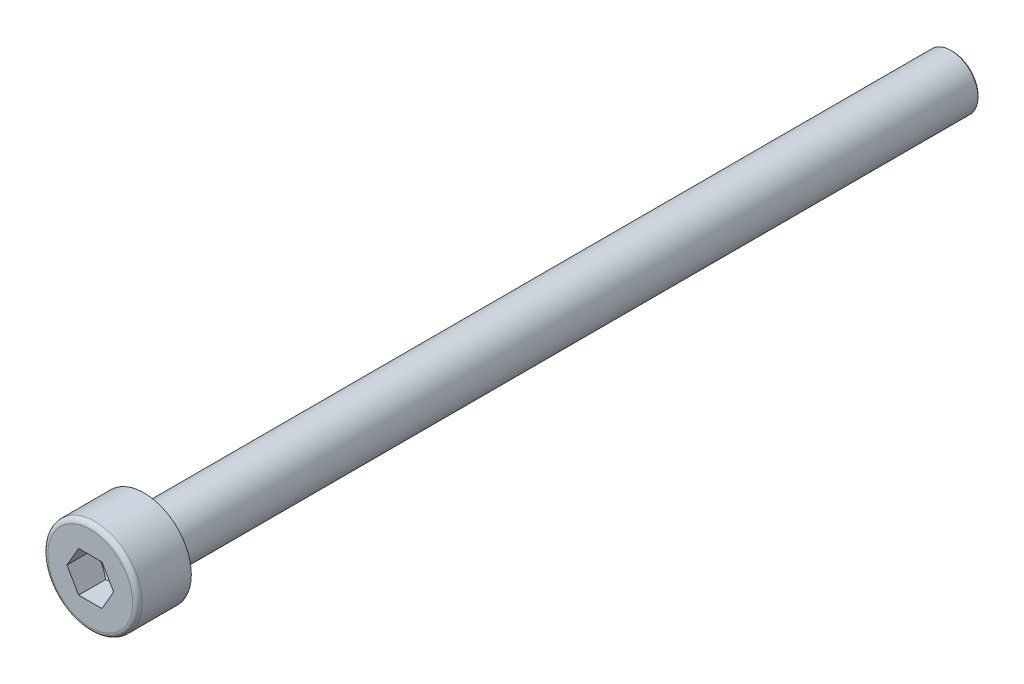
ISO-10303-21;
HEADER;
FILE_DESCRIPTION(('STEP AP214'),'2;1');
FILE_NAME('part.step','',(''),(''),'','','');
FILE_SCHEMA(('AUTOMOTIVE_DESIGN { 1 0 10303 214 1 1 1 1 }'));
ENDSEC;
DATA;
#1=APPLICATION_CONTEXT('core data for automotive mechanical design processes');
#2=APPLICATION_PROTOCOL_DEFINITION('international standard','automotive_design',2000,#1);
#3=PRODUCT_CONTEXT('',#1,'mechanical');
#4=PRODUCT('Part','Part','',(#3));
#5=PRODUCT_RELATED_PRODUCT_CATEGORY('part','',(#4));
#6=PRODUCT_DEFINITION_FORMATION('','',#4);
#7=PRODUCT_DEFINITION_CONTEXT('part definition',#1,'design');
#8=PRODUCT_DEFINITION('design','',#6,#7);
#9=PRODUCT_DEFINITION_SHAPE('','',#8);
#10=(LENGTH_UNIT() NAMED_UNIT(*) SI_UNIT(.MILLI.,.METRE.));
#11=(NAMED_UNIT(*) PLANE_ANGLE_UNIT() SI_UNIT($,.RADIAN.));
#12=(NAMED_UNIT(*) SI_UNIT($,.STERADIAN.) SOLID_ANGLE_UNIT());
#13=UNCERTAINTY_MEASURE_WITH_UNIT(LENGTH_MEASURE(1.E-05),#10,'distance_accuracy_value','');
#14=(GEOMETRIC_REPRESENTATION_CONTEXT(3) GLOBAL_UNCERTAINTY_ASSIGNED_CONTEXT((#13)) GLOBAL_UNIT_ASSIGNED_CONTEXT((#10,
#11,#12)) REPRESENTATION_CONTEXT('',''));
#15=CARTESIAN_POINT('',(0.,0.,0.));
#16=DIRECTION('',(0.,0.,1.));
#17=DIRECTION('',(1.,0.,0.));
#18=AXIS2_PLACEMENT_3D('',#15,#16,#17);
#19=CARTESIAN_POINT('',(0.,3.15,4.));
#20=DIRECTION('',(0.,0.,-1.));
#21=DIRECTION('',(-1.,0.,0.));
#22=AXIS2_PLACEMENT_3D('',#19,#20,#21);
#23=PLANE('',#22);
#24=CARTESIAN_POINT('',(0.,0.,4.));
#25=DIRECTION('',(0.,0.,1.));
#26=DIRECTION('',(1.,0.,0.));
#27=AXIS2_PLACEMENT_3D('',#24,#25,#26);
#28=CIRCLE('',#27,3.15);
#29=CARTESIAN_POINT('',(3.15,0.,4.));
#30=VERTEX_POINT('',#29);
#31=EDGE_CURVE('E136',#30,#30,#28,.T.);
#32=ORIENTED_EDGE('',*,*,#31,.T.);
#33=EDGE_LOOP('',(#32));
#34=FACE_BOUND('',#33,.T.);
#35=DIRECTION('',(0.5,-0.866025403784438,0.));
#36=VECTOR('',#35,1.);
#37=CARTESIAN_POINT('',(0.866025,1.49999930062484,4.));
#38=LINE('',#37,#36);
#39=CARTESIAN_POINT('',(0.866025,1.49999930062484,4.));
#40=VERTEX_POINT('',#39);
#41=CARTESIAN_POINT('',(1.73205,0.,4.));
#42=VERTEX_POINT('',#41);
#43=EDGE_CURVE('E50',#40,#42,#38,.T.);
#44=ORIENTED_EDGE('',*,*,#43,.T.);
#45=DIRECTION('',(-0.5,-0.866025403784439,0.));
#46=VECTOR('',#45,1.);
#47=CARTESIAN_POINT('',(1.73205,0.,4.));
#48=LINE('',#47,#46);
#49=CARTESIAN_POINT('',(0.866025,-1.49999930062484,4.));
#50=VERTEX_POINT('',#49);
#51=EDGE_CURVE('E199',#42,#50,#48,.T.);
#52=ORIENTED_EDGE('',*,*,#51,.T.);
#53=DIRECTION('',(-1.,0.,0.));
#54=VECTOR('',#53,1.);
#55=CARTESIAN_POINT('',(0.866025,-1.49999930062484,4.));
#56=LINE('',#55,#54);
#57=CARTESIAN_POINT('',(-0.866025,-1.49999930062484,4.));
#58=VERTEX_POINT('',#57);
#59=EDGE_CURVE('E253',#50,#58,#56,.T.);
#60=ORIENTED_EDGE('',*,*,#59,.T.);
#61=DIRECTION('',(-0.5,0.866025403784439,0.));
#62=VECTOR('',#61,1.);
#63=CARTESIAN_POINT('',(-0.866025,-1.49999930062484,4.));
#64=LINE('',#63,#62);
#65=CARTESIAN_POINT('',(-1.73205,0.,4.));
#66=VERTEX_POINT('',#65);
#67=EDGE_CURVE('E248',#58,#66,#64,.T.);
#68=ORIENTED_EDGE('',*,*,#67,.T.);
#69=DIRECTION('',(0.5,0.866025403784439,0.));
#70=VECTOR('',#69,1.);
#71=CARTESIAN_POINT('',(-1.73205,0.,4.));
#72=LINE('',#71,#70);
#73=CARTESIAN_POINT('',(-0.866025,1.49999930062484,4.));
#74=VERTEX_POINT('',#73);
#75=EDGE_CURVE('E122',#66,#74,#72,.T.);
#76=ORIENTED_EDGE('',*,*,#75,.T.);
#77=DIRECTION('',(1.,0.,0.));
#78=VECTOR('',#77,1.);
#79=CARTESIAN_POINT('',(-0.866025,1.49999930062484,4.));
#80=LINE('',#79,#78);
#81=EDGE_CURVE('E114',#74,#40,#80,.T.);
#82=ORIENTED_EDGE('',*,*,#81,.T.);
#83=EDGE_LOOP('',(#44,#52,#60,#68,#76,#82));
#84=FACE_BOUND('',#83,.T.);
#85=ADVANCED_FACE('F35',(#34,#84),#23,.F.);
#86=CARTESIAN_POINT('',(0.,0.,0.));
#87=DIRECTION('',(0.,0.,1.));
#88=DIRECTION('',(1.,0.,0.));
#89=AXIS2_PLACEMENT_3D('',#86,#87,#88);
#90=PLANE('',#89);
#91=CARTESIAN_POINT('',(0.,0.,0.));
#92=DIRECTION('',(0.,0.,1.));
#93=DIRECTION('',(1.,0.,0.));
#94=AXIS2_PLACEMENT_3D('',#91,#92,#93);
#95=CIRCLE('',#94,3.5);
#96=CARTESIAN_POINT('',(3.5,0.,0.));
#97=VERTEX_POINT('',#96);
#98=EDGE_CURVE('E144',#97,#97,#95,.T.);
#99=ORIENTED_EDGE('',*,*,#98,.F.);
#100=EDGE_LOOP('',(#99));
#101=FACE_BOUND('',#100,.T.);
#102=CARTESIAN_POINT('',(0.,0.,0.));
#103=DIRECTION('',(0.,0.,1.));
#104=DIRECTION('',(1.,0.,0.));
#105=AXIS2_PLACEMENT_3D('',#102,#103,#104);
#106=CIRCLE('',#105,2.);
#107=CARTESIAN_POINT('',(2.,0.,0.));
#108=VERTEX_POINT('',#107);
#109=EDGE_CURVE('E148',#108,#108,#106,.F.);
#110=ORIENTED_EDGE('',*,*,#109,.F.);
#111=EDGE_LOOP('',(#110));
#112=FACE_BOUND('',#111,.T.);
#113=ADVANCED_FACE('F164',(#101,#112),#90,.F.);
#114=CARTESIAN_POINT('',(0.,0.,4.));
#115=DIRECTION('',(0.,0.,1.));
#116=DIRECTION('',(1.,0.,0.));
#117=AXIS2_PLACEMENT_3D('',#114,#115,#116);
#118=CYLINDRICAL_SURFACE('',#117,3.5);
#119=CARTESIAN_POINT('',(0.,0.,3.65));
#120=DIRECTION('',(0.,0.,1.));
#121=DIRECTION('',(1.,0.,0.));
#122=AXIS2_PLACEMENT_3D('',#119,#120,#121);
#123=CIRCLE('',#122,3.5);
#124=CARTESIAN_POINT('',(3.5,0.,3.65));
#125=VERTEX_POINT('',#124);
#126=EDGE_CURVE('E140',#125,#125,#123,.T.);
#127=ORIENTED_EDGE('',*,*,#126,.F.);
#128=EDGE_LOOP('',(#127));
#129=FACE_BOUND('',#128,.T.);
#130=ORIENTED_EDGE('',*,*,#98,.T.);
#131=EDGE_LOOP('',(#130));
#132=FACE_BOUND('',#131,.T.);
#133=ADVANCED_FACE('F169',(#129,#132),#118,.T.);
#134=CARTESIAN_POINT('',(0.,0.,3.65));
#135=DIRECTION('',(0.,0.,1.));
#136=DIRECTION('',(1.,0.,0.));
#137=AXIS2_PLACEMENT_3D('',#134,#135,#136);
#138=TOROIDAL_SURFACE('',#137,3.15,0.35);
#139=ORIENTED_EDGE('',*,*,#31,.F.);
#140=EDGE_LOOP('',(#139));
#141=FACE_BOUND('',#140,.T.);
#142=ORIENTED_EDGE('',*,*,#126,.T.);
#143=EDGE_LOOP('',(#142));
#144=FACE_BOUND('',#143,.T.);
#145=ADVANCED_FACE('F176',(#141,#144),#138,.T.);
#146=CARTESIAN_POINT('',(0.866025,1.49999930062484,1.00000046625011));
#147=DIRECTION('',(-0.866025403784438,-0.5,0.));
#148=DIRECTION('',(-0.5,0.866025403784438,0.));
#149=AXIS2_PLACEMENT_3D('',#146,#147,#148);
#150=PLANE('',#149);
#151=DIRECTION('',(0.,0.,1.));
#152=VECTOR('',#151,1.);
#153=CARTESIAN_POINT('',(1.73205,0.,1.00000046625011));
#154=LINE('',#153,#152);
#155=CARTESIAN_POINT('',(1.73205,0.,2.));
#156=VERTEX_POINT('',#155);
#157=EDGE_CURVE('E134',#156,#42,#154,.T.);
#158=ORIENTED_EDGE('',*,*,#157,.T.);
#159=ORIENTED_EDGE('',*,*,#43,.F.);
#160=DIRECTION('',(0.,0.,1.));
#161=VECTOR('',#160,1.);
#162=CARTESIAN_POINT('',(0.866025,1.49999930062484,1.00000046625011));
#163=LINE('',#162,#161);
#164=CARTESIAN_POINT('',(0.866025,1.49999930062484,2.));
#165=VERTEX_POINT('',#164);
#166=EDGE_CURVE('E107',#165,#40,#163,.T.);
#167=ORIENTED_EDGE('',*,*,#166,.F.);
#168=CARTESIAN_POINT('',(1.73205115470054,-2.E-06,2.00000066666734));
#169=CARTESIAN_POINT('',(1.69399458130122,0.0659139186895892,1.97802228100261));
#170=CARTESIAN_POINT('',(1.65560950414464,0.132398822577242,1.95803408114054));
#171=CARTESIAN_POINT('',(1.57817473630843,0.266519774741864,1.92314525941874));
#172=CARTESIAN_POINT('',(1.53912367019894,0.334158205333232,1.90825697858766));
#173=CARTESIAN_POINT('',(1.46150547885139,0.468596856338784,1.88508226983918));
#174=CARTESIAN_POINT('',(1.42295029290091,0.535376397300293,1.87664158385231));
#175=CARTESIAN_POINT('',(1.34565859846878,0.669249539059823,1.86656700525616));
#176=CARTESIAN_POINT('',(1.30692237073331,0.736342653591208,1.86492476807133));
#177=CARTESIAN_POINT('',(1.23454773253413,0.861699204131607,1.86834969801067));
#178=CARTESIAN_POINT('',(1.20089846229767,0.919981449818777,1.87257593125167));
#179=CARTESIAN_POINT('',(1.1338191361032,1.03616625092508,1.88596796669928));
#180=CARTESIAN_POINT('',(1.10038931198579,1.09406840478452,1.89513833923059));
#181=CARTESIAN_POINT('',(1.03317179328088,1.21049256234014,1.91806252128818));
#182=CARTESIAN_POINT('',(0.999392601793287,1.26899983823525,1.93191346069662));
#183=CARTESIAN_POINT('',(0.932337893068965,1.38514200063251,1.96334924731355));
#184=CARTESIAN_POINT('',(0.89906151743008,1.4427783739308,1.980926712986));
#185=CARTESIAN_POINT('',(0.866023845299461,1.50000130062484,2.00000066666734));
#186=B_SPLINE_CURVE_WITH_KNOTS('',3,(#168,#169,#170,#171,#172,#173,#174,#175,#176,#177,#178,
#179,#180,#181,#182,#183,#184,#185),.UNSPECIFIED.,.F.,.F.,(4,2,2,2,2,2,2,2,4),(0.,
0.237762055931485,0.476095461361748,0.708530837844131,0.94068083294838,1.14278193102308,
1.34507017093339,1.55184422617205,1.75821246569164),.UNSPECIFIED.);
#187=EDGE_CURVE('E99',#156,#165,#186,.T.);
#188=ORIENTED_EDGE('',*,*,#187,.F.);
#189=EDGE_LOOP('',(#158,#159,#167,#188));
#190=FACE_BOUND('',#189,.T.);
#191=ADVANCED_FACE('F108',(#190),#150,.T.);
#192=CARTESIAN_POINT('',(1.73205,0.,1.00000046625011));
#193=DIRECTION('',(-0.866025403784439,0.5,0.));
#194=DIRECTION('',(0.5,0.866025403784439,0.));
#195=AXIS2_PLACEMENT_3D('',#192,#193,#194);
#196=PLANE('',#195);
#197=DIRECTION('',(0.,0.,1.));
#198=VECTOR('',#197,1.);
#199=CARTESIAN_POINT('',(0.866025,-1.49999930062484,1.00000046625011));
#200=LINE('',#199,#198);
#201=CARTESIAN_POINT('',(0.866025,-1.49999930062484,2.));
#202=VERTEX_POINT('',#201);
#203=EDGE_CURVE('E131',#202,#50,#200,.T.);
#204=ORIENTED_EDGE('',*,*,#203,.T.);
#205=ORIENTED_EDGE('',*,*,#51,.F.);
#206=ORIENTED_EDGE('',*,*,#157,.F.);
#207=CARTESIAN_POINT('',(0.866023845299462,-1.50000130062484,2.00000066666734));
#208=CARTESIAN_POINT('',(0.904080418698778,-1.43408538193525,1.9780222810026));
#209=CARTESIAN_POINT('',(0.942465495855361,-1.36760047804759,1.95803408114054));
#210=CARTESIAN_POINT('',(1.01990026369157,-1.23347952588297,1.92314525941874));
#211=CARTESIAN_POINT('',(1.05895132980106,-1.1658410952916,1.90825697858766));
#212=CARTESIAN_POINT('',(1.13656952114861,-1.03140244428605,1.88508226983918));
#213=CARTESIAN_POINT('',(1.1751247070991,-0.964622903324544,1.87664158385231));
#214=CARTESIAN_POINT('',(1.25241640153122,-0.830749761565014,1.86656700525616));
#215=CARTESIAN_POINT('',(1.29115262926669,-0.763656647033629,1.86492476807133));
#216=CARTESIAN_POINT('',(1.36352726746587,-0.638300096493229,1.86834969801067));
#217=CARTESIAN_POINT('',(1.39717653770233,-0.58001785080606,1.87257593125166));
#218=CARTESIAN_POINT('',(1.4642558638968,-0.463833049699756,1.88596796669928));
#219=CARTESIAN_POINT('',(1.49768568801421,-0.405930895840313,1.89513833923059));
#220=CARTESIAN_POINT('',(1.56490320671912,-0.2895067382847,1.91806252128818));
#221=CARTESIAN_POINT('',(1.59868239820671,-0.230999462389588,1.93191346069662));
#222=CARTESIAN_POINT('',(1.66573710693103,-0.11485729999233,1.96334924731355));
#223=CARTESIAN_POINT('',(1.69901348256992,-0.0572209266940348,1.980926712986));
#224=CARTESIAN_POINT('',(1.73205115470054,1.99999999979098E-06,2.00000066666734));
#225=B_SPLINE_CURVE_WITH_KNOTS('',3,(#207,#208,#209,#210,#211,#212,#213,#214,#215,#216,#217,
#218,#219,#220,#221,#222,#223,#224),.UNSPECIFIED.,.F.,.F.,(4,2,2,2,2,2,2,2,4),(0.,
0.237762055931484,0.476095461361747,0.708530837844129,0.940680832948377,1.14278193102307,
1.34507017093338,1.55184422617205,1.75821246569164),.UNSPECIFIED.);
#226=EDGE_CURVE('E103',#202,#156,#225,.T.);
#227=ORIENTED_EDGE('',*,*,#226,.F.);
#228=EDGE_LOOP('',(#204,#205,#206,#227));
#229=FACE_BOUND('',#228,.T.);
#230=ADVANCED_FACE('F187',(#229),#196,.T.);
#231=CARTESIAN_POINT('',(0.866025,-1.49999930062484,1.00000046625011));
#232=DIRECTION('',(0.,1.,0.));
#233=DIRECTION('',(1.,0.,0.));
#234=AXIS2_PLACEMENT_3D('',#231,#232,#233);
#235=PLANE('',#234);
#236=DIRECTION('',(0.,0.,1.));
#237=VECTOR('',#236,1.);
#238=CARTESIAN_POINT('',(-0.866025,-1.49999930062484,1.00000046625011));
#239=LINE('',#238,#237);
#240=CARTESIAN_POINT('',(-0.866025,-1.49999930062484,2.));
#241=VERTEX_POINT('',#240);
#242=EDGE_CURVE('E128',#241,#58,#239,.T.);
#243=ORIENTED_EDGE('',*,*,#242,.T.);
#244=ORIENTED_EDGE('',*,*,#59,.F.);
#245=ORIENTED_EDGE('',*,*,#203,.F.);
#246=CARTESIAN_POINT('',(-2.24271663728987,-1.49999930062484,2.55775267344395));
#247=CARTESIAN_POINT('',(-2.17794141332338,-1.49999930062484,2.52667596135368));
#248=CARTESIAN_POINT('',(-2.11300852130655,-1.49999930062484,2.49592211621229));
#249=CARTESIAN_POINT('',(-1.98274303131292,-1.49999930062484,2.43524311162405));
#250=CARTESIAN_POINT('',(-1.91741036395219,-1.49999930062484,2.40531810131238));
#251=CARTESIAN_POINT('',(-1.78588635397686,-1.49999930062484,2.34631254095844));
#252=CARTESIAN_POINT('',(-1.71969220663993,-1.49999930062484,2.31723821458641));
#253=CARTESIAN_POINT('',(-1.58674953026847,-1.49999930062484,2.26039396688304));
#254=CARTESIAN_POINT('',(-1.52000103027226,-1.49999930062484,2.23262397772829));
#255=CARTESIAN_POINT('',(-1.38408036083489,-1.49999930062484,2.17802545642731));
#256=CARTESIAN_POINT('',(-1.31489044686774,-1.49999930062484,2.1512405113674));
#257=CARTESIAN_POINT('',(-1.17568875836751,-1.49999930062484,2.09990652822181));
#258=CARTESIAN_POINT('',(-1.10567688208708,-1.49999930062484,2.07535777031023));
#259=CARTESIAN_POINT('',(-0.894522216300188,-1.49999930062484,2.0061010834001));
#260=CARTESIAN_POINT('',(-0.751873977094198,-1.49999930062484,1.9656202744164));
#261=CARTESIAN_POINT('',(-0.535047450977606,-1.49999930062484,1.9186645261203));
#262=CARTESIAN_POINT('',(-0.462365424606466,-1.49999930062484,1.90531291688069));
#263=CARTESIAN_POINT('',(-0.316183762847225,-1.49999930062484,1.8841134767258));
#264=CARTESIAN_POINT('',(-0.242684183051902,-1.49999930062484,1.87626527388084));
#265=CARTESIAN_POINT('',(-0.0961588910059515,-1.49999930062484,1.86679859934064));
#266=CARTESIAN_POINT('',(-0.0231380525234333,-1.49999930062484,1.86510661239957));
#267=CARTESIAN_POINT('',(0.122783022434076,-1.49999930062484,1.86789948707645));
#268=CARTESIAN_POINT('',(0.195683251161583,-1.49999930062484,1.8723847311637));
#269=CARTESIAN_POINT('',(0.375553746438775,-1.49999930062484,1.89067768491976));
#270=CARTESIAN_POINT('',(0.4821754471692,-1.49999930062484,1.90791354190592));
#271=CARTESIAN_POINT('',(0.693345462539466,-1.49999930062484,1.95235984396466));
#272=CARTESIAN_POINT('',(0.79789111749796,-1.49999930062484,1.97958231080908));
#273=CARTESIAN_POINT('',(0.954250638010105,-1.49999930062484,2.02608493590371));
#274=CARTESIAN_POINT('',(1.00687274480645,-1.49999930062484,2.04274751774646));
#275=CARTESIAN_POINT('',(1.11156919647057,-1.49999930062484,2.07761406562061));
#276=CARTESIAN_POINT('',(1.16364386068557,-1.49999930062484,2.09581706970924));
#277=CARTESIAN_POINT('',(1.26731501755411,-1.49999930062484,2.13350010092581));
#278=CARTESIAN_POINT('',(1.31891159517315,-1.49999930062484,2.15297989597396));
#279=CARTESIAN_POINT('',(1.42169818698628,-1.49999930062484,2.19300580386973));
#280=CARTESIAN_POINT('',(1.47288813079445,-1.49999930062484,2.21355209687612));
#281=CARTESIAN_POINT('',(1.6035520536722,-1.49999930062484,2.26731329701247));
#282=CARTESIAN_POINT('',(1.68276476914258,-1.49999930062484,2.30116251352867));
#283=CARTESIAN_POINT('',(1.84047488481565,-1.49999930062484,2.37049266735));
#284=CARTESIAN_POINT('',(1.9189722309026,-1.49999930062484,2.40597372689195));
#285=CARTESIAN_POINT('',(2.15362957255391,-1.49999930062484,2.51428942992019));
#286=CARTESIAN_POINT('',(2.3089286607519,-1.49999930062484,2.58898549353906));
#287=CARTESIAN_POINT('',(2.61820006623532,-1.49999930062484,2.74151036059574));
#288=CARTESIAN_POINT('',(2.77217051778771,-1.49999930062484,2.81934290231597));
#289=CARTESIAN_POINT('',(3.07905650209162,-1.49999930062484,2.97700931547993));
#290=CARTESIAN_POINT('',(3.23197216581148,-1.49999930062484,3.05684293253984));
#291=CARTESIAN_POINT('',(3.52267476728495,-1.49999930062484,3.21028853935711));
#292=CARTESIAN_POINT('',(3.66052737206612,-1.49999930062484,3.28377655462836));
#293=CARTESIAN_POINT('',(3.93578914881928,-1.49999930062484,3.43158990958268));
#294=CARTESIAN_POINT('',(4.07319830413762,-1.49999930062484,3.50591528025237));
#295=CARTESIAN_POINT('',(4.34732590427536,-1.49999930062483,3.65500351537988));
#296=CARTESIAN_POINT('',(4.48404521696312,-1.49999930062483,3.72976478622522));
#297=CARTESIAN_POINT('',(4.75720742747683,-1.49999930062483,3.87977391809883));
#298=CARTESIAN_POINT('',(4.89365033939364,-1.49999930062484,3.9550217534582));
#299=CARTESIAN_POINT('',(5.02999394665514,-1.49999930062484,4.03044801324502));
#300=B_SPLINE_CURVE_WITH_KNOTS('',3,(#246,#247,#248,#249,#250,#251,#252,#253,#254,#255,#256,
#257,#258,#259,#260,#261,#262,#263,#264,#265,#266,#267,#268,#269,#270,#271,#272,#273,#274,#275,
#276,#277,#278,#279,#280,#281,#282,#283,#284,#285,#286,#287,#288,#289,#290,#291,#292,#293,#294,
#295,#296,#297,#298,#299),.UNSPECIFIED.,.F.,.F.,(4,2,2,2,2,2,2,2,2,2,2,2,2,2,2,2,2,2,2,2,2,2,2,
2,2,2,4),(0.,0.215535408976475,0.431109351318747,0.647990972858705,0.864861304394723,
1.08740082372431,1.30996818700982,1.75384735851117,1.97537373294937,2.19688513480997,
2.41574248382684,2.63461338422016,2.95796620171825,3.28170955197757,3.44728283297626,
3.61275347131505,3.77819411534645,3.94366279806486,4.20206179692704,4.46048018336434,
4.97740230798824,5.49495989978084,6.01245202818902,6.48110050133562,6.94976637432356,
7.41724019162004,7.88468954517039),.UNSPECIFIED.);
#301=EDGE_CURVE('E224',#241,#202,#300,.T.);
#302=ORIENTED_EDGE('',*,*,#301,.F.);
#303=EDGE_LOOP('',(#243,#244,#245,#302));
#304=FACE_BOUND('',#303,.T.);
#305=ADVANCED_FACE('F229',(#304),#235,.T.);
#306=CARTESIAN_POINT('',(-0.866025,-1.49999930062484,1.00000046625011));
#307=DIRECTION('',(0.866025403784439,0.5,0.));
#308=DIRECTION('',(0.5,-0.866025403784439,0.));
#309=AXIS2_PLACEMENT_3D('',#306,#307,#308);
#310=PLANE('',#309);
#311=DIRECTION('',(0.,0.,1.));
#312=VECTOR('',#311,1.);
#313=CARTESIAN_POINT('',(-1.73205,0.,1.00000046625011));
#314=LINE('',#313,#312);
#315=CARTESIAN_POINT('',(-1.73205,0.,2.));
#316=VERTEX_POINT('',#315);
#317=EDGE_CURVE('E119',#316,#66,#314,.T.);
#318=ORIENTED_EDGE('',*,*,#317,.T.);
#319=ORIENTED_EDGE('',*,*,#67,.F.);
#320=ORIENTED_EDGE('',*,*,#242,.F.);
#321=CARTESIAN_POINT('',(-1.73205115470054,1.99999999935948E-06,2.00000066666734));
#322=CARTESIAN_POINT('',(-1.69399458130122,-0.0659139186895897,1.97802228100261));
#323=CARTESIAN_POINT('',(-1.65560950414464,-0.132398822577242,1.95803408114054));
#324=CARTESIAN_POINT('',(-1.57817473630843,-0.266519774741865,1.92314525941874));
#325=CARTESIAN_POINT('',(-1.53912367019894,-0.334158205333233,1.90825697858766));
#326=CARTESIAN_POINT('',(-1.46150547885139,-0.468596856338785,1.88508226983918));
#327=CARTESIAN_POINT('',(-1.4229502929009,-0.535376397300293,1.87664158385231));
#328=CARTESIAN_POINT('',(-1.34565859846878,-0.669249539059823,1.86656700525616));
#329=CARTESIAN_POINT('',(-1.30692237073331,-0.736342653591209,1.86492476807133));
#330=CARTESIAN_POINT('',(-1.23454773253413,-0.861699204131608,1.86834969801067));
#331=CARTESIAN_POINT('',(-1.20089846229767,-0.919981449818777,1.87257593125166));
#332=CARTESIAN_POINT('',(-1.1338191361032,-1.03616625092508,1.88596796669928));
#333=CARTESIAN_POINT('',(-1.10038931198579,-1.09406840478452,1.89513833923059));
#334=CARTESIAN_POINT('',(-1.03317179328088,-1.21049256234014,1.91806252128818));
#335=CARTESIAN_POINT('',(-0.999392601793289,-1.26899983823525,1.93191346069662));
#336=CARTESIAN_POINT('',(-0.932337893068967,-1.38514200063251,1.96334924731355));
#337=CARTESIAN_POINT('',(-0.899061517430081,-1.4427783739308,1.980926712986));
#338=CARTESIAN_POINT('',(-0.866023845299461,-1.50000130062484,2.00000066666734));
#339=B_SPLINE_CURVE_WITH_KNOTS('',3,(#321,#322,#323,#324,#325,#326,#327,#328,#329,#330,#331,
#332,#333,#334,#335,#336,#337,#338),.UNSPECIFIED.,.F.,.F.,(4,2,2,2,2,2,2,2,4),(0.,
0.237762055931485,0.476095461361749,0.708530837844132,0.94068083294838,1.14278193102308,
1.34507017093338,1.55184422617205,1.75821246569164),.UNSPECIFIED.);
#340=EDGE_CURVE('E219',#316,#241,#339,.T.);
#341=ORIENTED_EDGE('',*,*,#340,.F.);
#342=EDGE_LOOP('',(#318,#319,#320,#341));
#343=FACE_BOUND('',#342,.T.);
#344=ADVANCED_FACE('F232',(#343),#310,.T.);
#345=CARTESIAN_POINT('',(-1.73205,0.,1.00000046625011));
#346=DIRECTION('',(0.866025403784439,-0.5,0.));
#347=DIRECTION('',(-0.5,-0.866025403784439,0.));
#348=AXIS2_PLACEMENT_3D('',#345,#346,#347);
#349=PLANE('',#348);
#350=DIRECTION('',(0.,0.,1.));
#351=VECTOR('',#350,1.);
#352=CARTESIAN_POINT('',(-0.866025,1.49999930062484,1.00000046625011));
#353=LINE('',#352,#351);
#354=CARTESIAN_POINT('',(-0.866025,1.49999930062484,2.));
#355=VERTEX_POINT('',#354);
#356=EDGE_CURVE('E113',#355,#74,#353,.T.);
#357=ORIENTED_EDGE('',*,*,#356,.T.);
#358=ORIENTED_EDGE('',*,*,#75,.F.);
#359=ORIENTED_EDGE('',*,*,#317,.F.);
#360=CARTESIAN_POINT('',(-0.866023845299462,1.50000130062484,2.00000066666734));
#361=CARTESIAN_POINT('',(-0.904080418698778,1.43408538193525,1.9780222810026));
#362=CARTESIAN_POINT('',(-0.942465495855361,1.36760047804759,1.95803408114054));
#363=CARTESIAN_POINT('',(-1.01990026369157,1.23347952588297,1.92314525941874));
#364=CARTESIAN_POINT('',(-1.05895132980106,1.1658410952916,1.90825697858766));
#365=CARTESIAN_POINT('',(-1.13656952114861,1.03140244428605,1.88508226983918));
#366=CARTESIAN_POINT('',(-1.1751247070991,0.964622903324544,1.87664158385231));
#367=CARTESIAN_POINT('',(-1.25241640153122,0.830749761565014,1.86656700525616));
#368=CARTESIAN_POINT('',(-1.29115262926669,0.763656647033629,1.86492476807133));
#369=CARTESIAN_POINT('',(-1.36352726746587,0.638300096493229,1.86834969801067));
#370=CARTESIAN_POINT('',(-1.39717653770233,0.58001785080606,1.87257593125166));
#371=CARTESIAN_POINT('',(-1.4642558638968,0.463833049699756,1.88596796669928));
#372=CARTESIAN_POINT('',(-1.49768568801421,0.405930895840313,1.89513833923059));
#373=CARTESIAN_POINT('',(-1.56490320671912,0.289506738284699,1.91806252128818));
#374=CARTESIAN_POINT('',(-1.59868239820671,0.230999462389588,1.93191346069662));
#375=CARTESIAN_POINT('',(-1.66573710693103,0.11485729999233,1.96334924731355));
#376=CARTESIAN_POINT('',(-1.69901348256992,0.0572209266940344,1.980926712986));
#377=CARTESIAN_POINT('',(-1.73205115470054,-2.00000000048508E-06,2.00000066666734));
#378=B_SPLINE_CURVE_WITH_KNOTS('',3,(#360,#361,#362,#363,#364,#365,#366,#367,#368,#369,#370,
#371,#372,#373,#374,#375,#376,#377),.UNSPECIFIED.,.F.,.F.,(4,2,2,2,2,2,2,2,4),(0.,
0.237762055931484,0.476095461361747,0.708530837844129,0.940680832948377,1.14278193102307,
1.34507017093338,1.55184422617205,1.75821246569164),.UNSPECIFIED.);
#379=EDGE_CURVE('E58',#355,#316,#378,.T.);
#380=ORIENTED_EDGE('',*,*,#379,.F.);
#381=EDGE_LOOP('',(#357,#358,#359,#380));
#382=FACE_BOUND('',#381,.T.);
#383=ADVANCED_FACE('F236',(#382),#349,.T.);
#384=CARTESIAN_POINT('',(-0.866025,1.49999930062484,1.00000046625011));
#385=DIRECTION('',(0.,-1.,0.));
#386=DIRECTION('',(-1.,0.,0.));
#387=AXIS2_PLACEMENT_3D('',#384,#385,#386);
#388=PLANE('',#387);
#389=ORIENTED_EDGE('',*,*,#166,.T.);
#390=ORIENTED_EDGE('',*,*,#81,.F.);
#391=ORIENTED_EDGE('',*,*,#356,.F.);
#392=CARTESIAN_POINT('',(-2.24271663728987,1.49999930062484,2.55775267344395));
#393=CARTESIAN_POINT('',(-2.17794141332338,1.49999930062484,2.52667596135368));
#394=CARTESIAN_POINT('',(-2.11300852130655,1.49999930062484,2.49592211621229));
#395=CARTESIAN_POINT('',(-1.98274303131292,1.49999930062484,2.43524311162405));
#396=CARTESIAN_POINT('',(-1.91741036395219,1.49999930062484,2.40531810131238));
#397=CARTESIAN_POINT('',(-1.78588635397687,1.49999930062484,2.34631254095844));
#398=CARTESIAN_POINT('',(-1.71969220663993,1.49999930062484,2.31723821458641));
#399=CARTESIAN_POINT('',(-1.58674953026847,1.49999930062484,2.26039396688304));
#400=CARTESIAN_POINT('',(-1.52000103027226,1.49999930062484,2.23262397772829));
#401=CARTESIAN_POINT('',(-1.3840803608349,1.49999930062484,2.17802545642731));
#402=CARTESIAN_POINT('',(-1.31489044686775,1.49999930062484,2.1512405113674));
#403=CARTESIAN_POINT('',(-1.17568875836751,1.49999930062484,2.09990652822181));
#404=CARTESIAN_POINT('',(-1.10567688208708,1.49999930062484,2.07535777031023));
#405=CARTESIAN_POINT('',(-0.894522216300189,1.49999930062484,2.0061010834001));
#406=CARTESIAN_POINT('',(-0.751873977094199,1.49999930062484,1.9656202744164));
#407=CARTESIAN_POINT('',(-0.535047450977607,1.49999930062484,1.9186645261203));
#408=CARTESIAN_POINT('',(-0.462365424606467,1.49999930062484,1.90531291688069));
#409=CARTESIAN_POINT('',(-0.316183762847226,1.49999930062484,1.8841134767258));
#410=CARTESIAN_POINT('',(-0.242684183051903,1.49999930062484,1.87626527388084));
#411=CARTESIAN_POINT('',(-0.0961588910059524,1.49999930062484,1.86679859934064));
#412=CARTESIAN_POINT('',(-0.0231380525234342,1.49999930062484,1.86510661239957));
#413=CARTESIAN_POINT('',(0.122783022434075,1.49999930062484,1.86789948707645));
#414=CARTESIAN_POINT('',(0.195683251161582,1.49999930062484,1.8723847311637));
#415=CARTESIAN_POINT('',(0.375553746438774,1.49999930062484,1.89067768491976));
#416=CARTESIAN_POINT('',(0.482175447169199,1.49999930062484,1.90791354190592));
#417=CARTESIAN_POINT('',(0.693345462539464,1.49999930062484,1.95235984396466));
#418=CARTESIAN_POINT('',(0.797891117497957,1.49999930062484,1.97958231080908));
#419=CARTESIAN_POINT('',(0.954250638010102,1.49999930062484,2.02608493590371));
#420=CARTESIAN_POINT('',(1.00687274480645,1.49999930062484,2.04274751774646));
#421=CARTESIAN_POINT('',(1.11156919647056,1.49999930062484,2.07761406562061));
#422=CARTESIAN_POINT('',(1.16364386068556,1.49999930062484,2.09581706970924));
#423=CARTESIAN_POINT('',(1.2673150175541,1.49999930062484,2.13350010092581));
#424=CARTESIAN_POINT('',(1.31891159517315,1.49999930062484,2.15297989597396));
#425=CARTESIAN_POINT('',(1.42169818698628,1.49999930062484,2.19300580386972));
#426=CARTESIAN_POINT('',(1.47288813079445,1.49999930062484,2.21355209687612));
#427=CARTESIAN_POINT('',(1.60355205367219,1.49999930062484,2.26731329701247));
#428=CARTESIAN_POINT('',(1.68276476914257,1.49999930062484,2.30116251352867));
#429=CARTESIAN_POINT('',(1.84047488481565,1.49999930062484,2.37049266735));
#430=CARTESIAN_POINT('',(1.91897223090259,1.49999930062484,2.40597372689195));
#431=CARTESIAN_POINT('',(2.15362957255391,1.49999930062484,2.51428942992019));
#432=CARTESIAN_POINT('',(2.30892866075189,1.49999930062484,2.58898549353906));
#433=CARTESIAN_POINT('',(2.61820006623532,1.49999930062484,2.74151036059574));
#434=CARTESIAN_POINT('',(2.77217051778771,1.49999930062484,2.81934290231597));
#435=CARTESIAN_POINT('',(3.07905650209162,1.49999930062484,2.97700931547993));
#436=CARTESIAN_POINT('',(3.23197216581148,1.49999930062484,3.05684293253984));
#437=CARTESIAN_POINT('',(3.52267476728495,1.49999930062484,3.21028853935711));
#438=CARTESIAN_POINT('',(3.66052737206611,1.49999930062484,3.28377655462836));
#439=CARTESIAN_POINT('',(3.93578914881928,1.49999930062484,3.43158990958268));
#440=CARTESIAN_POINT('',(4.07319830413762,1.49999930062484,3.50591528025237));
#441=CARTESIAN_POINT('',(4.34732590427536,1.49999930062484,3.65500351537988));
#442=CARTESIAN_POINT('',(4.48404521696312,1.49999930062484,3.72976478622523));
#443=CARTESIAN_POINT('',(4.75720742747683,1.49999930062484,3.87977391809883));
#444=CARTESIAN_POINT('',(4.89365033939364,1.49999930062484,3.9550217534582));
#445=CARTESIAN_POINT('',(5.02999394665514,1.49999930062484,4.03044801324502));
#446=B_SPLINE_CURVE_WITH_KNOTS('',3,(#392,#393,#394,#395,#396,#397,#398,#399,#400,#401,#402,
#403,#404,#405,#406,#407,#408,#409,#410,#411,#412,#413,#414,#415,#416,#417,#418,#419,#420,#421,
#422,#423,#424,#425,#426,#427,#428,#429,#430,#431,#432,#433,#434,#435,#436,#437,#438,#439,#440,
#441,#442,#443,#444,#445),.UNSPECIFIED.,.F.,.F.,(4,2,2,2,2,2,2,2,2,2,2,2,2,2,2,2,2,2,2,2,2,2,2,
2,2,2,4),(0.,0.215535408976474,0.431109351318746,0.647990972858704,0.864861304394721,
1.0874008237243,1.30996818700982,1.75384735851117,1.97537373294937,2.19688513480997,
2.41574248382684,2.63461338422015,2.95796620171825,3.28170955197757,3.44728283297626,
3.61275347131505,3.77819411534645,3.94366279806485,4.20206179692704,4.46048018336433,
4.97740230798824,5.49495989978084,6.01245202818902,6.48110050133561,6.94976637432355,
7.41724019162004,7.88468954517039),.UNSPECIFIED.);
#447=EDGE_CURVE('E100',#165,#355,#446,.F.);
#448=ORIENTED_EDGE('',*,*,#447,.F.);
#449=EDGE_LOOP('',(#389,#390,#391,#448));
#450=FACE_BOUND('',#449,.T.);
#451=ADVANCED_FACE('F95',(#450),#388,.T.);
#452=CARTESIAN_POINT('',(0.,0.,1.00000046625011));
#453=DIRECTION('',(0.,0.,1.));
#454=DIRECTION('',(1.,0.,0.));
#455=AXIS2_PLACEMENT_3D('',#452,#453,#454);
#456=CONICAL_SURFACE('',#455,0.,1.0471975511966);
#457=CARTESIAN_POINT('',(0.,0.,1.00000046625011));
#458=VERTEX_POINT('',#457);
#459=VERTEX_LOOP('',#458);
#460=FACE_BOUND('',#459,.T.);
#461=ORIENTED_EDGE('',*,*,#187,.T.);
#462=ORIENTED_EDGE('',*,*,#447,.T.);
#463=ORIENTED_EDGE('',*,*,#379,.T.);
#464=ORIENTED_EDGE('',*,*,#340,.T.);
#465=ORIENTED_EDGE('',*,*,#301,.T.);
#466=ORIENTED_EDGE('',*,*,#226,.T.);
#467=EDGE_LOOP('',(#461,#462,#463,#464,#465,#466));
#468=FACE_BOUND('',#467,.T.);
#469=ADVANCED_FACE('F91',(#460,#468),#456,.F.);
#470=CARTESIAN_POINT('',(0.,0.,0.));
#471=DIRECTION('',(0.,0.,1.));
#472=DIRECTION('',(1.,0.,0.));
#473=AXIS2_PLACEMENT_3D('',#470,#471,#472);
#474=CYLINDRICAL_SURFACE('',#473,2.);
#475=CARTESIAN_POINT('',(0.,0.,-59.9));
#476=DIRECTION('',(0.,0.,-1.));
#477=DIRECTION('',(-1.,0.,0.));
#478=AXIS2_PLACEMENT_3D('',#475,#476,#477);
#479=CIRCLE('',#478,2.);
#480=CARTESIAN_POINT('',(-2.,0.,-59.9));
#481=VERTEX_POINT('',#480);
#482=EDGE_CURVE('E11',#481,#481,#479,.F.);
#483=ORIENTED_EDGE('',*,*,#482,.T.);
#484=EDGE_LOOP('',(#483));
#485=FACE_BOUND('',#484,.T.);
#486=ORIENTED_EDGE('',*,*,#109,.T.);
#487=EDGE_LOOP('',(#486));
#488=FACE_BOUND('',#487,.T.);
#489=ADVANCED_FACE('F94',(#485,#488),#474,.T.);
#490=CARTESIAN_POINT('',(0.,0.,-60.));
#491=DIRECTION('',(0.,0.,-1.));
#492=DIRECTION('',(-1.,0.,0.));
#493=AXIS2_PLACEMENT_3D('',#490,#491,#492);
#494=PLANE('',#493);
#495=CARTESIAN_POINT('',(0.,0.,-60.));
#496=DIRECTION('',(0.,0.,-1.));
#497=DIRECTION('',(-1.,0.,0.));
#498=AXIS2_PLACEMENT_3D('',#495,#496,#497);
#499=CIRCLE('',#498,1.89999999999999);
#500=CARTESIAN_POINT('',(-1.89999999999998,0.,-60.));
#501=VERTEX_POINT('',#500);
#502=EDGE_CURVE('E43',#501,#501,#499,.T.);
#503=ORIENTED_EDGE('',*,*,#502,.T.);
#504=EDGE_LOOP('',(#503));
#505=FACE_BOUND('',#504,.T.);
#506=ADVANCED_FACE('F154',(#505),#494,.T.);
#507=CARTESIAN_POINT('',(0.,0.,-60.));
#508=DIRECTION('',(0.,0.,1.));
#509=DIRECTION('',(1.,0.,0.));
#510=AXIS2_PLACEMENT_3D('',#507,#508,#509);
#511=CONICAL_SURFACE('',#510,1.89999999999999,0.785398163397405);
#512=ORIENTED_EDGE('',*,*,#482,.F.);
#513=EDGE_LOOP('',(#512));
#514=FACE_BOUND('',#513,.T.);
#515=ORIENTED_EDGE('',*,*,#502,.F.);
#516=EDGE_LOOP('',(#515));
#517=FACE_BOUND('',#516,.T.);
#518=ADVANCED_FACE('F37',(#514,#517),#511,.T.);
#519=CLOSED_SHELL('',(#85,#113,#133,#145,#191,#230,#305,#344,#383,#451,#469,#489,#506,#518));
#520=MANIFOLD_SOLID_BREP('B2',#519);
#521=ADVANCED_BREP_SHAPE_REPRESENTATION('',(#18,#520),#14);
#522=SHAPE_DEFINITION_REPRESENTATION(#9,#521);
ENDSEC;
END-ISO-10303-21;
